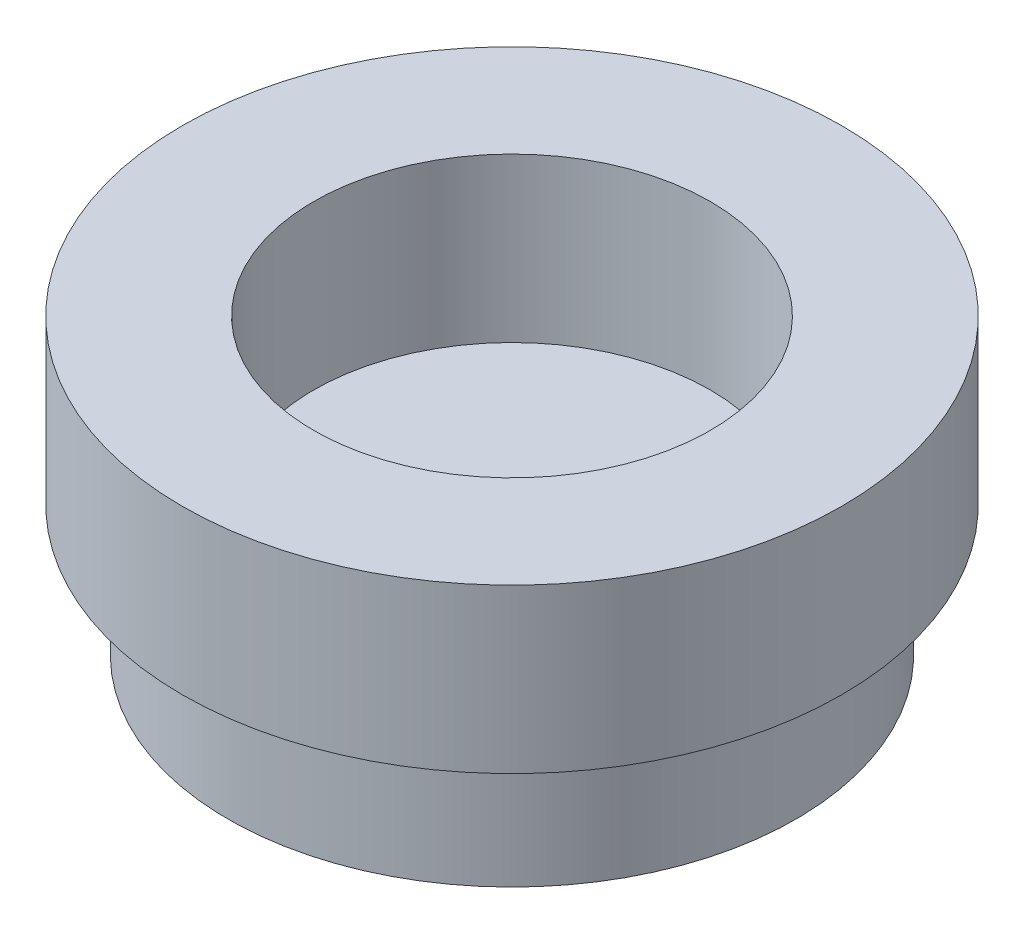
ISO-10303-21;
HEADER;
FILE_DESCRIPTION(('STEP AP214'),'2;1');
FILE_NAME('part.step','',(''),(''),'','','');
FILE_SCHEMA(('AUTOMOTIVE_DESIGN { 1 0 10303 214 1 1 1 1 }'));
ENDSEC;
DATA;
#1=APPLICATION_CONTEXT('core data for automotive mechanical design processes');
#2=APPLICATION_PROTOCOL_DEFINITION('international standard','automotive_design',2000,#1);
#3=PRODUCT_CONTEXT('',#1,'mechanical');
#4=PRODUCT('Part','Part','',(#3));
#5=PRODUCT_RELATED_PRODUCT_CATEGORY('part','',(#4));
#6=PRODUCT_DEFINITION_FORMATION('','',#4);
#7=PRODUCT_DEFINITION_CONTEXT('part definition',#1,'design');
#8=PRODUCT_DEFINITION('design','',#6,#7);
#9=PRODUCT_DEFINITION_SHAPE('','',#8);
#10=(LENGTH_UNIT() NAMED_UNIT(*) SI_UNIT(.MILLI.,.METRE.));
#11=(NAMED_UNIT(*) PLANE_ANGLE_UNIT() SI_UNIT($,.RADIAN.));
#12=(NAMED_UNIT(*) SI_UNIT($,.STERADIAN.) SOLID_ANGLE_UNIT());
#13=UNCERTAINTY_MEASURE_WITH_UNIT(LENGTH_MEASURE(1.E-05),#10,'distance_accuracy_value','');
#14=(GEOMETRIC_REPRESENTATION_CONTEXT(3) GLOBAL_UNCERTAINTY_ASSIGNED_CONTEXT((#13)) GLOBAL_UNIT_ASSIGNED_CONTEXT((#10,
#11,#12)) REPRESENTATION_CONTEXT('',''));
#15=CARTESIAN_POINT('',(0.,0.,0.));
#16=DIRECTION('',(0.,0.,1.));
#17=DIRECTION('',(1.,0.,0.));
#18=AXIS2_PLACEMENT_3D('',#15,#16,#17);
#19=CARTESIAN_POINT('',(0.,0.,0.));
#20=DIRECTION('',(0.,1.,0.));
#21=DIRECTION('',(0.,0.,1.));
#22=AXIS2_PLACEMENT_3D('',#19,#20,#21);
#23=PLANE('',#22);
#24=CARTESIAN_POINT('',(0.,0.,0.));
#25=DIRECTION('',(0.,-1.,0.));
#26=DIRECTION('',(0.,0.,-1.));
#27=AXIS2_PLACEMENT_3D('',#24,#25,#26);
#28=CIRCLE('',#27,4.35);
#29=CARTESIAN_POINT('',(0.,0.,-4.35));
#30=VERTEX_POINT('',#29);
#31=EDGE_CURVE('E10',#30,#30,#28,.T.);
#32=ORIENTED_EDGE('',*,*,#31,.T.);
#33=EDGE_LOOP('',(#32));
#34=FACE_BOUND('',#33,.T.);
#35=ADVANCED_FACE('F40',(#34),#23,.F.);
#36=CARTESIAN_POINT('',(0.,0.,0.));
#37=DIRECTION('',(0.,-1.,0.));
#38=DIRECTION('',(0.,0.,-1.));
#39=AXIS2_PLACEMENT_3D('',#36,#37,#38);
#40=CYLINDRICAL_SURFACE('',#39,4.35);
#41=ORIENTED_EDGE('',*,*,#31,.F.);
#42=EDGE_LOOP('',(#41));
#43=FACE_BOUND('',#42,.T.);
#44=CARTESIAN_POINT('',(0.,2.,0.));
#45=DIRECTION('',(0.,-1.,0.));
#46=DIRECTION('',(0.,0.,-1.));
#47=AXIS2_PLACEMENT_3D('',#44,#45,#46);
#48=CIRCLE('',#47,4.35);
#49=CARTESIAN_POINT('',(0.,2.,-4.35));
#50=VERTEX_POINT('',#49);
#51=EDGE_CURVE('E43',#50,#50,#48,.T.);
#52=ORIENTED_EDGE('',*,*,#51,.T.);
#53=EDGE_LOOP('',(#52));
#54=FACE_BOUND('',#53,.T.);
#55=ADVANCED_FACE('F75',(#43,#54),#40,.T.);
#56=CARTESIAN_POINT('',(-4.35,2.,0.));
#57=DIRECTION('',(0.,1.,0.));
#58=DIRECTION('',(0.,0.,1.));
#59=AXIS2_PLACEMENT_3D('',#56,#57,#58);
#60=PLANE('',#59);
#61=ORIENTED_EDGE('',*,*,#51,.F.);
#62=EDGE_LOOP('',(#61));
#63=FACE_BOUND('',#62,.T.);
#64=CARTESIAN_POINT('',(0.,2.,0.));
#65=DIRECTION('',(0.,-1.,0.));
#66=DIRECTION('',(0.,0.,-1.));
#67=AXIS2_PLACEMENT_3D('',#64,#65,#66);
#68=CIRCLE('',#67,5.05);
#69=CARTESIAN_POINT('',(0.,2.,-5.05));
#70=VERTEX_POINT('',#69);
#71=EDGE_CURVE('E50',#70,#70,#68,.T.);
#72=ORIENTED_EDGE('',*,*,#71,.T.);
#73=EDGE_LOOP('',(#72));
#74=FACE_BOUND('',#73,.T.);
#75=ADVANCED_FACE('F80',(#63,#74),#60,.F.);
#76=CARTESIAN_POINT('',(0.,0.,0.));
#77=DIRECTION('',(0.,-1.,0.));
#78=DIRECTION('',(0.,0.,-1.));
#79=AXIS2_PLACEMENT_3D('',#76,#77,#78);
#80=CYLINDRICAL_SURFACE('',#79,5.05);
#81=ORIENTED_EDGE('',*,*,#71,.F.);
#82=EDGE_LOOP('',(#81));
#83=FACE_BOUND('',#82,.T.);
#84=CARTESIAN_POINT('',(0.,4.5,0.));
#85=DIRECTION('',(0.,-1.,0.));
#86=DIRECTION('',(0.,0.,-1.));
#87=AXIS2_PLACEMENT_3D('',#84,#85,#86);
#88=CIRCLE('',#87,5.05);
#89=CARTESIAN_POINT('',(0.,4.5,-5.05));
#90=VERTEX_POINT('',#89);
#91=EDGE_CURVE('E51',#90,#90,#88,.T.);
#92=ORIENTED_EDGE('',*,*,#91,.T.);
#93=EDGE_LOOP('',(#92));
#94=FACE_BOUND('',#93,.T.);
#95=ADVANCED_FACE('F84',(#83,#94),#80,.T.);
#96=CARTESIAN_POINT('',(-5.05,4.5,0.));
#97=DIRECTION('',(0.,-1.,0.));
#98=DIRECTION('',(0.,0.,-1.));
#99=AXIS2_PLACEMENT_3D('',#96,#97,#98);
#100=PLANE('',#99);
#101=ORIENTED_EDGE('',*,*,#91,.F.);
#102=EDGE_LOOP('',(#101));
#103=FACE_BOUND('',#102,.T.);
#104=CARTESIAN_POINT('',(0.,4.5,0.));
#105=DIRECTION('',(0.,-1.,0.));
#106=DIRECTION('',(0.,0.,-1.));
#107=AXIS2_PLACEMENT_3D('',#104,#105,#106);
#108=CIRCLE('',#107,3.0375);
#109=CARTESIAN_POINT('',(0.,4.5,-3.0375));
#110=VERTEX_POINT('',#109);
#111=EDGE_CURVE('E57',#110,#110,#108,.T.);
#112=ORIENTED_EDGE('',*,*,#111,.T.);
#113=EDGE_LOOP('',(#112));
#114=FACE_BOUND('',#113,.T.);
#115=ADVANCED_FACE('F71',(#103,#114),#100,.F.);
#116=CARTESIAN_POINT('',(0.,0.,0.));
#117=DIRECTION('',(0.,-1.,0.));
#118=DIRECTION('',(0.,0.,-1.));
#119=AXIS2_PLACEMENT_3D('',#116,#117,#118);
#120=CYLINDRICAL_SURFACE('',#119,3.0375);
#121=ORIENTED_EDGE('',*,*,#111,.F.);
#122=EDGE_LOOP('',(#121));
#123=FACE_BOUND('',#122,.T.);
#124=CARTESIAN_POINT('',(0.,2.,0.));
#125=DIRECTION('',(0.,-1.,0.));
#126=DIRECTION('',(0.,0.,-1.));
#127=AXIS2_PLACEMENT_3D('',#124,#125,#126);
#128=CIRCLE('',#127,3.0375);
#129=CARTESIAN_POINT('',(0.,2.,-3.0375));
#130=VERTEX_POINT('',#129);
#131=EDGE_CURVE('E56',#130,#130,#128,.T.);
#132=ORIENTED_EDGE('',*,*,#131,.T.);
#133=EDGE_LOOP('',(#132));
#134=FACE_BOUND('',#133,.T.);
#135=ADVANCED_FACE('F64',(#123,#134),#120,.F.);
#136=CARTESIAN_POINT('',(-3.0375,2.,0.));
#137=DIRECTION('',(0.,-1.,0.));
#138=DIRECTION('',(0.,0.,-1.));
#139=AXIS2_PLACEMENT_3D('',#136,#137,#138);
#140=PLANE('',#139);
#141=ORIENTED_EDGE('',*,*,#131,.F.);
#142=EDGE_LOOP('',(#141));
#143=FACE_BOUND('',#142,.T.);
#144=ADVANCED_FACE('F65',(#143),#140,.F.);
#145=CLOSED_SHELL('',(#35,#55,#75,#95,#115,#135,#144));
#146=MANIFOLD_SOLID_BREP('B2',#145);
#147=ADVANCED_BREP_SHAPE_REPRESENTATION('',(#18,#146),#14);
#148=SHAPE_DEFINITION_REPRESENTATION(#9,#147);
ENDSEC;
END-ISO-10303-21;
